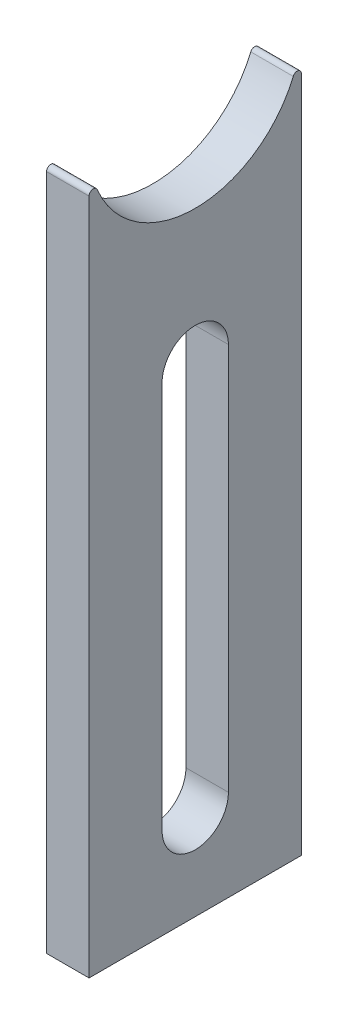
ISO-10303-21;
HEADER;
FILE_DESCRIPTION(('STEP AP214'),'2;1');
FILE_NAME('part.step','',(''),(''),'','','');
FILE_SCHEMA(('AUTOMOTIVE_DESIGN { 1 0 10303 214 1 1 1 1 }'));
ENDSEC;
DATA;
#1=APPLICATION_CONTEXT('core data for automotive mechanical design processes');
#2=APPLICATION_PROTOCOL_DEFINITION('international standard','automotive_design',2000,#1);
#3=PRODUCT_CONTEXT('',#1,'mechanical');
#4=PRODUCT('Part','Part','',(#3));
#5=PRODUCT_RELATED_PRODUCT_CATEGORY('part','',(#4));
#6=PRODUCT_DEFINITION_FORMATION('','',#4);
#7=PRODUCT_DEFINITION_CONTEXT('part definition',#1,'design');
#8=PRODUCT_DEFINITION('design','',#6,#7);
#9=PRODUCT_DEFINITION_SHAPE('','',#8);
#10=(LENGTH_UNIT() NAMED_UNIT(*) SI_UNIT(.MILLI.,.METRE.));
#11=(NAMED_UNIT(*) PLANE_ANGLE_UNIT() SI_UNIT($,.RADIAN.));
#12=(NAMED_UNIT(*) SI_UNIT($,.STERADIAN.) SOLID_ANGLE_UNIT());
#13=UNCERTAINTY_MEASURE_WITH_UNIT(LENGTH_MEASURE(1.E-05),#10,'distance_accuracy_value','');
#14=(GEOMETRIC_REPRESENTATION_CONTEXT(3) GLOBAL_UNCERTAINTY_ASSIGNED_CONTEXT((#13)) GLOBAL_UNIT_ASSIGNED_CONTEXT((#10,
#11,#12)) REPRESENTATION_CONTEXT('',''));
#15=CARTESIAN_POINT('',(0.,0.,0.));
#16=DIRECTION('',(0.,0.,1.));
#17=DIRECTION('',(1.,0.,0.));
#18=AXIS2_PLACEMENT_3D('',#15,#16,#17);
#19=CARTESIAN_POINT('',(2.54,0.,0.));
#20=DIRECTION('',(-1.,0.,0.));
#21=DIRECTION('',(0.,0.,1.));
#22=AXIS2_PLACEMENT_3D('',#19,#20,#21);
#23=CYLINDRICAL_SURFACE('',#22,6.35);
#24=CARTESIAN_POINT('',(0.,0.,0.));
#25=DIRECTION('',(1.,0.,0.));
#26=DIRECTION('',(0.,0.,-1.));
#27=AXIS2_PLACEMENT_3D('',#24,#25,#26);
#28=CIRCLE('',#27,6.35);
#29=CARTESIAN_POINT('',(0.,-2.44230769230769,5.86153846153846));
#30=VERTEX_POINT('',#29);
#31=CARTESIAN_POINT('',(0.,-2.44230769230769,-5.86153846153846));
#32=VERTEX_POINT('',#31);
#33=EDGE_CURVE('E144',#30,#32,#28,.T.);
#34=ORIENTED_EDGE('',*,*,#33,.F.);
#35=DIRECTION('',(-1.,0.,0.));
#36=VECTOR('',#35,1.);
#37=CARTESIAN_POINT('',(2.54,-2.44230769230769,5.86153846153846));
#38=LINE('',#37,#36);
#39=CARTESIAN_POINT('',(2.54,-2.44230769230769,5.86153846153846));
#40=VERTEX_POINT('',#39);
#41=EDGE_CURVE('E183',#30,#40,#38,.F.);
#42=ORIENTED_EDGE('',*,*,#41,.T.);
#43=CARTESIAN_POINT('',(2.54,0.,0.));
#44=DIRECTION('',(1.,0.,0.));
#45=DIRECTION('',(0.,0.,-1.));
#46=AXIS2_PLACEMENT_3D('',#43,#44,#45);
#47=CIRCLE('',#46,6.35);
#48=CARTESIAN_POINT('',(2.54,-2.44230769230769,-5.86153846153846));
#49=VERTEX_POINT('',#48);
#50=EDGE_CURVE('E148',#40,#49,#47,.T.);
#51=ORIENTED_EDGE('',*,*,#50,.T.);
#52=DIRECTION('',(-1.,0.,0.));
#53=VECTOR('',#52,1.);
#54=CARTESIAN_POINT('',(2.54,-2.44230769230769,-5.86153846153846));
#55=LINE('',#54,#53);
#56=EDGE_CURVE('E180',#49,#32,#55,.T.);
#57=ORIENTED_EDGE('',*,*,#56,.T.);
#58=EDGE_LOOP('',(#34,#42,#51,#57));
#59=FACE_BOUND('',#58,.T.);
#60=ADVANCED_FACE('F35',(#59),#23,.F.);
#61=CARTESIAN_POINT('',(2.54,0.,6.35));
#62=DIRECTION('',(0.,0.,-1.));
#63=DIRECTION('',(-1.,0.,0.));
#64=AXIS2_PLACEMENT_3D('',#61,#62,#63);
#65=PLANE('',#64);
#66=DIRECTION('',(0.,-1.,0.));
#67=VECTOR('',#66,1.);
#68=CARTESIAN_POINT('',(2.54,0.,6.35));
#69=LINE('',#68,#67);
#70=CARTESIAN_POINT('',(2.54,-2.54,6.35));
#71=VERTEX_POINT('',#70);
#72=CARTESIAN_POINT('',(2.54,-43.0365933637258,6.35));
#73=VERTEX_POINT('',#72);
#74=EDGE_CURVE('E151',#71,#73,#69,.T.);
#75=ORIENTED_EDGE('',*,*,#74,.F.);
#76=DIRECTION('',(1.,0.,0.));
#77=VECTOR('',#76,1.);
#78=CARTESIAN_POINT('',(0.,-2.54,6.35));
#79=LINE('',#78,#77);
#80=CARTESIAN_POINT('',(0.,-2.54,6.35));
#81=VERTEX_POINT('',#80);
#82=EDGE_CURVE('E173',#71,#81,#79,.F.);
#83=ORIENTED_EDGE('',*,*,#82,.T.);
#84=DIRECTION('',(0.,-1.,0.));
#85=VECTOR('',#84,1.);
#86=CARTESIAN_POINT('',(0.,0.,6.35));
#87=LINE('',#86,#85);
#88=CARTESIAN_POINT('',(0.,-43.0365933637258,6.35));
#89=VERTEX_POINT('',#88);
#90=EDGE_CURVE('E162',#81,#89,#87,.T.);
#91=ORIENTED_EDGE('',*,*,#90,.T.);
#92=DIRECTION('',(-1.,0.,0.));
#93=VECTOR('',#92,1.);
#94=CARTESIAN_POINT('',(2.54,-43.0365933637258,6.35));
#95=LINE('',#94,#93);
#96=EDGE_CURVE('E170',#73,#89,#95,.T.);
#97=ORIENTED_EDGE('',*,*,#96,.F.);
#98=EDGE_LOOP('',(#75,#83,#91,#97));
#99=FACE_BOUND('',#98,.T.);
#100=ADVANCED_FACE('F194',(#99),#65,.F.);
#101=CARTESIAN_POINT('',(2.54,-43.0365933637258,0.));
#102=DIRECTION('',(0.,1.,0.));
#103=DIRECTION('',(0.,0.,1.));
#104=AXIS2_PLACEMENT_3D('',#101,#102,#103);
#105=PLANE('',#104);
#106=DIRECTION('',(0.,0.,-1.));
#107=VECTOR('',#106,1.);
#108=CARTESIAN_POINT('',(0.,-43.0365933637258,0.));
#109=LINE('',#108,#107);
#110=CARTESIAN_POINT('',(0.,-43.0365933637258,-6.35));
#111=VERTEX_POINT('',#110);
#112=EDGE_CURVE('E164',#89,#111,#109,.T.);
#113=ORIENTED_EDGE('',*,*,#112,.T.);
#114=DIRECTION('',(-1.,0.,0.));
#115=VECTOR('',#114,1.);
#116=CARTESIAN_POINT('',(2.54,-43.0365933637258,-6.35));
#117=LINE('',#116,#115);
#118=CARTESIAN_POINT('',(2.54,-43.0365933637258,-6.35));
#119=VERTEX_POINT('',#118);
#120=EDGE_CURVE('E159',#119,#111,#117,.T.);
#121=ORIENTED_EDGE('',*,*,#120,.F.);
#122=DIRECTION('',(0.,0.,-1.));
#123=VECTOR('',#122,1.);
#124=CARTESIAN_POINT('',(2.54,-43.0365933637258,0.));
#125=LINE('',#124,#123);
#126=EDGE_CURVE('E154',#73,#119,#125,.T.);
#127=ORIENTED_EDGE('',*,*,#126,.F.);
#128=ORIENTED_EDGE('',*,*,#96,.T.);
#129=EDGE_LOOP('',(#113,#121,#127,#128));
#130=FACE_BOUND('',#129,.T.);
#131=ADVANCED_FACE('F213',(#130),#105,.F.);
#132=CARTESIAN_POINT('',(2.54,0.,-6.35));
#133=DIRECTION('',(0.,0.,-1.));
#134=DIRECTION('',(-1.,0.,0.));
#135=AXIS2_PLACEMENT_3D('',#132,#133,#134);
#136=PLANE('',#135);
#137=DIRECTION('',(0.,-1.,0.));
#138=VECTOR('',#137,1.);
#139=CARTESIAN_POINT('',(0.,0.,-6.35));
#140=LINE('',#139,#138);
#141=CARTESIAN_POINT('',(0.,-2.54,-6.35));
#142=VERTEX_POINT('',#141);
#143=EDGE_CURVE('E152',#142,#111,#140,.T.);
#144=ORIENTED_EDGE('',*,*,#143,.F.);
#145=DIRECTION('',(-1.,0.,0.));
#146=VECTOR('',#145,1.);
#147=CARTESIAN_POINT('',(2.54,-2.54,-6.35));
#148=LINE('',#147,#146);
#149=CARTESIAN_POINT('',(2.54,-2.54,-6.35));
#150=VERTEX_POINT('',#149);
#151=EDGE_CURVE('E11',#142,#150,#148,.F.);
#152=ORIENTED_EDGE('',*,*,#151,.T.);
#153=DIRECTION('',(0.,-1.,0.));
#154=VECTOR('',#153,1.);
#155=CARTESIAN_POINT('',(2.54,0.,-6.35));
#156=LINE('',#155,#154);
#157=EDGE_CURVE('E157',#150,#119,#156,.T.);
#158=ORIENTED_EDGE('',*,*,#157,.T.);
#159=ORIENTED_EDGE('',*,*,#120,.T.);
#160=EDGE_LOOP('',(#144,#152,#158,#159));
#161=FACE_BOUND('',#160,.T.);
#162=ADVANCED_FACE('F209',(#161),#136,.T.);
#163=CARTESIAN_POINT('',(2.54,0.,0.));
#164=DIRECTION('',(1.,0.,0.));
#165=DIRECTION('',(0.,0.,-1.));
#166=AXIS2_PLACEMENT_3D('',#163,#164,#165);
#167=PLANE('',#166);
#168=CARTESIAN_POINT('',(2.54,-14.3931089053595,0.));
#169=DIRECTION('',(-1.,0.,0.));
#170=DIRECTION('',(0.,0.,1.));
#171=AXIS2_PLACEMENT_3D('',#168,#169,#170);
#172=CIRCLE('',#171,1.984375);
#173=CARTESIAN_POINT('',(2.54,-14.3931089053595,1.984375));
#174=VERTEX_POINT('',#173);
#175=CARTESIAN_POINT('',(2.54,-14.3931089053595,-1.984375));
#176=VERTEX_POINT('',#175);
#177=EDGE_CURVE('E113',#174,#176,#172,.T.);
#178=ORIENTED_EDGE('',*,*,#177,.T.);
#179=DIRECTION('',(0.,-1.,0.));
#180=VECTOR('',#179,1.);
#181=CARTESIAN_POINT('',(2.54,-14.3931089053595,-1.984375));
#182=LINE('',#181,#180);
#183=CARTESIAN_POINT('',(2.54,-37.5851871930166,-1.984375));
#184=VERTEX_POINT('',#183);
#185=EDGE_CURVE('E122',#176,#184,#182,.T.);
#186=ORIENTED_EDGE('',*,*,#185,.T.);
#187=CARTESIAN_POINT('',(2.54,-37.5851871930166,0.));
#188=DIRECTION('',(-1.,0.,0.));
#189=DIRECTION('',(0.,0.,1.));
#190=AXIS2_PLACEMENT_3D('',#187,#188,#189);
#191=CIRCLE('',#190,1.984375);
#192=CARTESIAN_POINT('',(2.54,-37.5851871930166,1.984375));
#193=VERTEX_POINT('',#192);
#194=EDGE_CURVE('E50',#184,#193,#191,.T.);
#195=ORIENTED_EDGE('',*,*,#194,.T.);
#196=DIRECTION('',(0.,1.,0.));
#197=VECTOR('',#196,1.);
#198=CARTESIAN_POINT('',(2.54,-14.3931089053595,1.984375));
#199=LINE('',#198,#197);
#200=EDGE_CURVE('E119',#193,#174,#199,.T.);
#201=ORIENTED_EDGE('',*,*,#200,.T.);
#202=EDGE_LOOP('',(#178,#186,#195,#201));
#203=FACE_BOUND('',#202,.T.);
#204=ORIENTED_EDGE('',*,*,#50,.F.);
#205=CARTESIAN_POINT('',(2.54,-2.54,6.096));
#206=DIRECTION('',(1.,0.,0.));
#207=DIRECTION('',(0.,0.,-1.));
#208=AXIS2_PLACEMENT_3D('',#205,#206,#207);
#209=CIRCLE('',#208,0.254);
#210=EDGE_CURVE('E43',#40,#71,#209,.T.);
#211=ORIENTED_EDGE('',*,*,#210,.T.);
#212=ORIENTED_EDGE('',*,*,#74,.T.);
#213=ORIENTED_EDGE('',*,*,#126,.T.);
#214=ORIENTED_EDGE('',*,*,#157,.F.);
#215=CARTESIAN_POINT('',(2.54,-2.54,-6.096));
#216=DIRECTION('',(1.,0.,0.));
#217=DIRECTION('',(0.,0.,-1.));
#218=AXIS2_PLACEMENT_3D('',#215,#216,#217);
#219=CIRCLE('',#218,0.254);
#220=EDGE_CURVE('E185',#150,#49,#219,.T.);
#221=ORIENTED_EDGE('',*,*,#220,.T.);
#222=EDGE_LOOP('',(#204,#211,#212,#213,#214,#221));
#223=FACE_BOUND('',#222,.T.);
#224=ADVANCED_FACE('F126',(#203,#223),#167,.T.);
#225=CARTESIAN_POINT('',(0.,0.,0.));
#226=DIRECTION('',(1.,0.,0.));
#227=DIRECTION('',(0.,0.,-1.));
#228=AXIS2_PLACEMENT_3D('',#225,#226,#227);
#229=PLANE('',#228);
#230=DIRECTION('',(0.,-1.,0.));
#231=VECTOR('',#230,1.);
#232=CARTESIAN_POINT('',(0.,-14.3931089053595,-1.984375));
#233=LINE('',#232,#231);
#234=CARTESIAN_POINT('',(0.,-14.3931089053595,-1.984375));
#235=VERTEX_POINT('',#234);
#236=CARTESIAN_POINT('',(0.,-37.5851871930166,-1.984375));
#237=VERTEX_POINT('',#236);
#238=EDGE_CURVE('E138',#235,#237,#233,.T.);
#239=ORIENTED_EDGE('',*,*,#238,.F.);
#240=CARTESIAN_POINT('',(0.,-14.3931089053595,0.));
#241=DIRECTION('',(-1.,0.,0.));
#242=DIRECTION('',(0.,0.,1.));
#243=AXIS2_PLACEMENT_3D('',#240,#241,#242);
#244=CIRCLE('',#243,1.984375);
#245=CARTESIAN_POINT('',(0.,-14.3931089053595,1.984375));
#246=VERTEX_POINT('',#245);
#247=EDGE_CURVE('E58',#246,#235,#244,.T.);
#248=ORIENTED_EDGE('',*,*,#247,.F.);
#249=DIRECTION('',(0.,1.,0.));
#250=VECTOR('',#249,1.);
#251=CARTESIAN_POINT('',(0.,-14.3931089053595,1.984375));
#252=LINE('',#251,#250);
#253=CARTESIAN_POINT('',(0.,-37.5851871930166,1.984375));
#254=VERTEX_POINT('',#253);
#255=EDGE_CURVE('E129',#254,#246,#252,.T.);
#256=ORIENTED_EDGE('',*,*,#255,.F.);
#257=CARTESIAN_POINT('',(0.,-37.5851871930166,0.));
#258=DIRECTION('',(-1.,0.,0.));
#259=DIRECTION('',(0.,0.,1.));
#260=AXIS2_PLACEMENT_3D('',#257,#258,#259);
#261=CIRCLE('',#260,1.984375);
#262=EDGE_CURVE('E132',#237,#254,#261,.T.);
#263=ORIENTED_EDGE('',*,*,#262,.F.);
#264=EDGE_LOOP('',(#239,#248,#256,#263));
#265=FACE_BOUND('',#264,.T.);
#266=ORIENTED_EDGE('',*,*,#90,.F.);
#267=CARTESIAN_POINT('',(0.,-2.54,6.096));
#268=DIRECTION('',(1.,0.,0.));
#269=DIRECTION('',(0.,0.,-1.));
#270=AXIS2_PLACEMENT_3D('',#267,#268,#269);
#271=CIRCLE('',#270,0.254);
#272=EDGE_CURVE('E178',#81,#30,#271,.F.);
#273=ORIENTED_EDGE('',*,*,#272,.T.);
#274=ORIENTED_EDGE('',*,*,#33,.T.);
#275=CARTESIAN_POINT('',(0.,-2.54,-6.096));
#276=DIRECTION('',(1.,0.,0.));
#277=DIRECTION('',(0.,0.,-1.));
#278=AXIS2_PLACEMENT_3D('',#275,#276,#277);
#279=CIRCLE('',#278,0.254);
#280=EDGE_CURVE('E176',#32,#142,#279,.F.);
#281=ORIENTED_EDGE('',*,*,#280,.T.);
#282=ORIENTED_EDGE('',*,*,#143,.T.);
#283=ORIENTED_EDGE('',*,*,#112,.F.);
#284=EDGE_LOOP('',(#266,#273,#274,#281,#282,#283));
#285=FACE_BOUND('',#284,.T.);
#286=ADVANCED_FACE('F200',(#265,#285),#229,.F.);
#287=CARTESIAN_POINT('',(2.54,-2.54,6.096));
#288=DIRECTION('',(-1.,0.,0.));
#289=DIRECTION('',(0.,0.,1.));
#290=AXIS2_PLACEMENT_3D('',#287,#288,#289);
#291=CYLINDRICAL_SURFACE('',#290,0.254);
#292=ORIENTED_EDGE('',*,*,#210,.F.);
#293=ORIENTED_EDGE('',*,*,#41,.F.);
#294=ORIENTED_EDGE('',*,*,#272,.F.);
#295=ORIENTED_EDGE('',*,*,#82,.F.);
#296=EDGE_LOOP('',(#292,#293,#294,#295));
#297=FACE_BOUND('',#296,.T.);
#298=ADVANCED_FACE('F197',(#297),#291,.T.);
#299=CARTESIAN_POINT('',(2.54,-2.54,-6.096));
#300=DIRECTION('',(-1.,0.,0.));
#301=DIRECTION('',(0.,0.,1.));
#302=AXIS2_PLACEMENT_3D('',#299,#300,#301);
#303=CYLINDRICAL_SURFACE('',#302,0.254);
#304=ORIENTED_EDGE('',*,*,#220,.F.);
#305=ORIENTED_EDGE('',*,*,#151,.F.);
#306=ORIENTED_EDGE('',*,*,#280,.F.);
#307=ORIENTED_EDGE('',*,*,#56,.F.);
#308=EDGE_LOOP('',(#304,#305,#306,#307));
#309=FACE_BOUND('',#308,.T.);
#310=ADVANCED_FACE('F37',(#309),#303,.T.);
#311=CARTESIAN_POINT('',(2.54,-14.3931089053595,0.));
#312=DIRECTION('',(-1.,0.,0.));
#313=DIRECTION('',(0.,0.,1.));
#314=AXIS2_PLACEMENT_3D('',#311,#312,#313);
#315=CYLINDRICAL_SURFACE('',#314,1.984375);
#316=ORIENTED_EDGE('',*,*,#247,.T.);
#317=DIRECTION('',(-1.,0.,0.));
#318=VECTOR('',#317,1.);
#319=CARTESIAN_POINT('',(2.54,-14.3931089053595,-1.984375));
#320=LINE('',#319,#318);
#321=EDGE_CURVE('E109',#176,#235,#320,.T.);
#322=ORIENTED_EDGE('',*,*,#321,.F.);
#323=ORIENTED_EDGE('',*,*,#177,.F.);
#324=DIRECTION('',(-1.,0.,0.));
#325=VECTOR('',#324,1.);
#326=CARTESIAN_POINT('',(2.54,-14.3931089053595,1.984375));
#327=LINE('',#326,#325);
#328=EDGE_CURVE('E142',#174,#246,#327,.T.);
#329=ORIENTED_EDGE('',*,*,#328,.T.);
#330=EDGE_LOOP('',(#316,#322,#323,#329));
#331=FACE_BOUND('',#330,.T.);
#332=ADVANCED_FACE('F111',(#331),#315,.F.);
#333=CARTESIAN_POINT('',(2.54,-14.3931089053595,1.984375));
#334=DIRECTION('',(0.,0.,1.));
#335=DIRECTION('',(0.,-1.,0.));
#336=AXIS2_PLACEMENT_3D('',#333,#334,#335);
#337=PLANE('',#336);
#338=ORIENTED_EDGE('',*,*,#255,.T.);
#339=ORIENTED_EDGE('',*,*,#328,.F.);
#340=ORIENTED_EDGE('',*,*,#200,.F.);
#341=DIRECTION('',(-1.,0.,0.));
#342=VECTOR('',#341,1.);
#343=CARTESIAN_POINT('',(2.54,-37.5851871930166,1.984375));
#344=LINE('',#343,#342);
#345=EDGE_CURVE('E145',#193,#254,#344,.T.);
#346=ORIENTED_EDGE('',*,*,#345,.T.);
#347=EDGE_LOOP('',(#338,#339,#340,#346));
#348=FACE_BOUND('',#347,.T.);
#349=ADVANCED_FACE('F240',(#348),#337,.F.);
#350=CARTESIAN_POINT('',(2.54,-37.5851871930166,0.));
#351=DIRECTION('',(-1.,0.,0.));
#352=DIRECTION('',(0.,0.,1.));
#353=AXIS2_PLACEMENT_3D('',#350,#351,#352);
#354=CYLINDRICAL_SURFACE('',#353,1.984375);
#355=ORIENTED_EDGE('',*,*,#262,.T.);
#356=ORIENTED_EDGE('',*,*,#345,.F.);
#357=ORIENTED_EDGE('',*,*,#194,.F.);
#358=DIRECTION('',(-1.,0.,0.));
#359=VECTOR('',#358,1.);
#360=CARTESIAN_POINT('',(2.54,-37.5851871930166,-1.984375));
#361=LINE('',#360,#359);
#362=EDGE_CURVE('E118',#184,#237,#361,.T.);
#363=ORIENTED_EDGE('',*,*,#362,.T.);
#364=EDGE_LOOP('',(#355,#356,#357,#363));
#365=FACE_BOUND('',#364,.T.);
#366=ADVANCED_FACE('F243',(#365),#354,.F.);
#367=CARTESIAN_POINT('',(2.54,-14.3931089053595,-1.984375));
#368=DIRECTION('',(0.,0.,-1.));
#369=DIRECTION('',(0.,1.,0.));
#370=AXIS2_PLACEMENT_3D('',#367,#368,#369);
#371=PLANE('',#370);
#372=ORIENTED_EDGE('',*,*,#238,.T.);
#373=ORIENTED_EDGE('',*,*,#362,.F.);
#374=ORIENTED_EDGE('',*,*,#185,.F.);
#375=ORIENTED_EDGE('',*,*,#321,.T.);
#376=EDGE_LOOP('',(#372,#373,#374,#375));
#377=FACE_BOUND('',#376,.T.);
#378=ADVANCED_FACE('F123',(#377),#371,.F.);
#379=CLOSED_SHELL('',(#60,#100,#131,#162,#224,#286,#298,#310,#332,#349,#366,#378));
#380=MANIFOLD_SOLID_BREP('B2',#379);
#381=ADVANCED_BREP_SHAPE_REPRESENTATION('',(#18,#380),#14);
#382=SHAPE_DEFINITION_REPRESENTATION(#9,#381);
ENDSEC;
END-ISO-10303-21;
